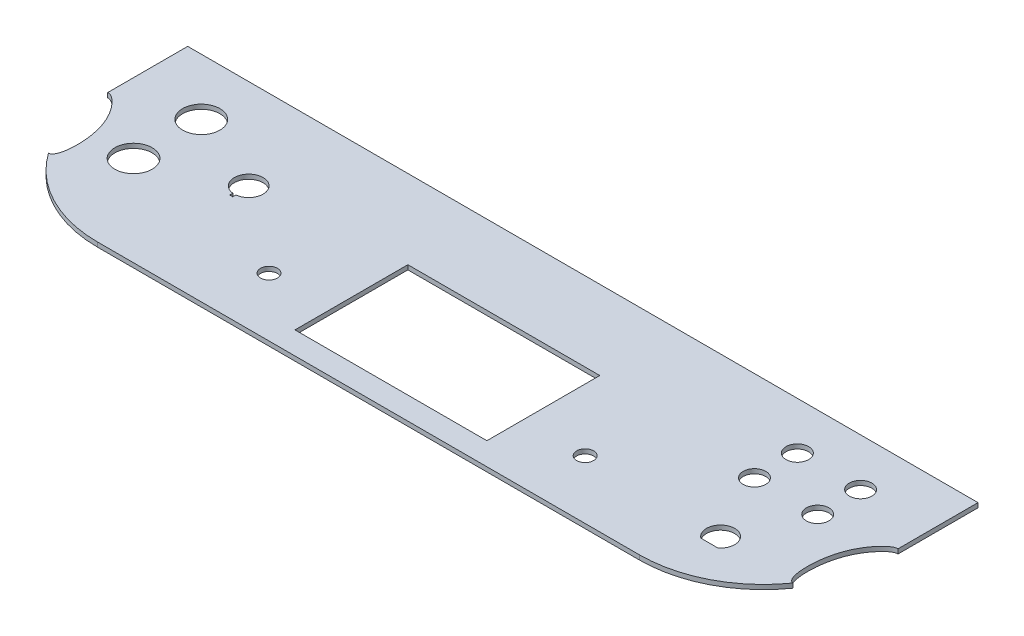
ISO-10303-21;
HEADER;
FILE_DESCRIPTION(('STEP AP214'),'2;1');
FILE_NAME('part.step','',(''),(''),'','','');
FILE_SCHEMA(('AUTOMOTIVE_DESIGN { 1 0 10303 214 1 1 1 1 }'));
ENDSEC;
DATA;
#1=APPLICATION_CONTEXT('core data for automotive mechanical design processes');
#2=APPLICATION_PROTOCOL_DEFINITION('international standard','automotive_design',2000,#1);
#3=PRODUCT_CONTEXT('',#1,'mechanical');
#4=PRODUCT('Part','Part','',(#3));
#5=PRODUCT_RELATED_PRODUCT_CATEGORY('part','',(#4));
#6=PRODUCT_DEFINITION_FORMATION('','',#4);
#7=PRODUCT_DEFINITION_CONTEXT('part definition',#1,'design');
#8=PRODUCT_DEFINITION('design','',#6,#7);
#9=PRODUCT_DEFINITION_SHAPE('','',#8);
#10=(LENGTH_UNIT() NAMED_UNIT(*) SI_UNIT(.MILLI.,.METRE.));
#11=(NAMED_UNIT(*) PLANE_ANGLE_UNIT() SI_UNIT($,.RADIAN.));
#12=(NAMED_UNIT(*) SI_UNIT($,.STERADIAN.) SOLID_ANGLE_UNIT());
#13=UNCERTAINTY_MEASURE_WITH_UNIT(LENGTH_MEASURE(1.E-05),#10,'distance_accuracy_value','');
#14=(GEOMETRIC_REPRESENTATION_CONTEXT(3) GLOBAL_UNCERTAINTY_ASSIGNED_CONTEXT((#13)) GLOBAL_UNIT_ASSIGNED_CONTEXT((#10,
#11,#12)) REPRESENTATION_CONTEXT('',''));
#15=CARTESIAN_POINT('',(0.,0.,0.));
#16=DIRECTION('',(0.,0.,1.));
#17=DIRECTION('',(1.,0.,0.));
#18=AXIS2_PLACEMENT_3D('',#15,#16,#17);
#19=CARTESIAN_POINT('',(152.4,2.54,14.612459998599));
#20=DIRECTION('',(0.,-1.,0.));
#21=DIRECTION('',(0.,0.,-1.));
#22=AXIS2_PLACEMENT_3D('',#19,#20,#21);
#23=CYLINDRICAL_SURFACE('',#22,69.8499999999999);
#24=DIRECTION('',(0.,1.,0.));
#25=VECTOR('',#24,1.);
#26=CARTESIAN_POINT('',(209.440289816918,1.27000000000001,54.929055063187));
#27=LINE('',#26,#25);
#28=CARTESIAN_POINT('',(209.440289816918,2.54,54.929055063187));
#29=VERTEX_POINT('',#28);
#30=CARTESIAN_POINT('',(209.440289816918,0.,54.929055063187));
#31=VERTEX_POINT('',#30);
#32=EDGE_CURVE('E384',#29,#31,#27,.F.);
#33=ORIENTED_EDGE('',*,*,#32,.F.);
#34=CARTESIAN_POINT('',(152.4,2.54,14.612459998599));
#35=DIRECTION('',(0.,1.,0.));
#36=DIRECTION('',(0.,0.,-1.));
#37=AXIS2_PLACEMENT_3D('',#34,#35,#36);
#38=CIRCLE('',#37,69.8499999999999);
#39=CARTESIAN_POINT('',(152.4,2.54,84.4624599985988));
#40=VERTEX_POINT('',#39);
#41=EDGE_CURVE('E414',#40,#29,#38,.T.);
#42=ORIENTED_EDGE('',*,*,#41,.F.);
#43=DIRECTION('',(0.,-1.,0.));
#44=VECTOR('',#43,1.);
#45=CARTESIAN_POINT('',(152.4,2.54,84.4624599985988));
#46=LINE('',#45,#44);
#47=CARTESIAN_POINT('',(152.4,0.,84.4624599985988));
#48=VERTEX_POINT('',#47);
#49=EDGE_CURVE('E415',#40,#48,#46,.T.);
#50=ORIENTED_EDGE('',*,*,#49,.T.);
#51=CARTESIAN_POINT('',(152.4,0.,14.612459998599));
#52=DIRECTION('',(0.,1.,0.));
#53=DIRECTION('',(0.,0.,-1.));
#54=AXIS2_PLACEMENT_3D('',#51,#52,#53);
#55=CIRCLE('',#54,69.8499999999999);
#56=EDGE_CURVE('E395',#48,#31,#55,.T.);
#57=ORIENTED_EDGE('',*,*,#56,.T.);
#58=EDGE_LOOP('',(#33,#42,#50,#57));
#59=FACE_BOUND('',#58,.T.);
#60=ADVANCED_FACE('F46',(#59),#23,.T.);
#61=CARTESIAN_POINT('',(222.25,2.54,14.612459998599));
#62=DIRECTION('',(-1.,0.,0.));
#63=DIRECTION('',(0.,0.,1.));
#64=AXIS2_PLACEMENT_3D('',#61,#62,#63);
#65=PLANE('',#64);
#66=DIRECTION('',(0.,1.,0.));
#67=VECTOR('',#66,1.);
#68=CARTESIAN_POINT('',(222.25,1.27000000000001,8.82955846627022));
#69=LINE('',#68,#67);
#70=CARTESIAN_POINT('',(222.250000005227,0.,8.82955846706889));
#71=VERTEX_POINT('',#70);
#72=CARTESIAN_POINT('',(222.250000005227,2.54,8.82955846706889));
#73=VERTEX_POINT('',#72);
#74=EDGE_CURVE('E307',#71,#73,#69,.T.);
#75=ORIENTED_EDGE('',*,*,#74,.F.);
#76=DIRECTION('',(0.,0.,-1.));
#77=VECTOR('',#76,1.);
#78=CARTESIAN_POINT('',(222.25,0.,14.612459998599));
#79=LINE('',#78,#77);
#80=CARTESIAN_POINT('',(222.25,0.,-36.187540001401));
#81=VERTEX_POINT('',#80);
#82=EDGE_CURVE('E380',#71,#81,#79,.T.);
#83=ORIENTED_EDGE('',*,*,#82,.T.);
#84=DIRECTION('',(0.,-1.,0.));
#85=VECTOR('',#84,1.);
#86=CARTESIAN_POINT('',(222.25,2.54,-36.187540001401));
#87=LINE('',#86,#85);
#88=CARTESIAN_POINT('',(222.25,2.54,-36.187540001401));
#89=VERTEX_POINT('',#88);
#90=EDGE_CURVE('E11',#89,#81,#87,.T.);
#91=ORIENTED_EDGE('',*,*,#90,.F.);
#92=DIRECTION('',(0.,0.,-1.));
#93=VECTOR('',#92,1.);
#94=CARTESIAN_POINT('',(222.25,2.54,14.612459998599));
#95=LINE('',#94,#93);
#96=EDGE_CURVE('E381',#73,#89,#95,.T.);
#97=ORIENTED_EDGE('',*,*,#96,.F.);
#98=EDGE_LOOP('',(#75,#83,#91,#97));
#99=FACE_BOUND('',#98,.T.);
#100=ADVANCED_FACE('F351',(#99),#65,.F.);
#101=CARTESIAN_POINT('',(152.4,2.54,14.612459998599));
#102=DIRECTION('',(0.,-1.,0.));
#103=DIRECTION('',(0.,0.,-1.));
#104=AXIS2_PLACEMENT_3D('',#101,#102,#103);
#105=PLANE('',#104);
#106=CARTESIAN_POINT('',(182.88,2.54,-9.51754000140104));
#107=DIRECTION('',(0.,1.,0.));
#108=DIRECTION('',(0.,0.,1.));
#109=AXIS2_PLACEMENT_3D('',#106,#107,#108);
#110=CIRCLE('',#109,6.35);
#111=CARTESIAN_POINT('',(182.88,2.54,-3.16754000140104));
#112=VERTEX_POINT('',#111);
#113=EDGE_CURVE('E237',#112,#112,#110,.T.);
#114=ORIENTED_EDGE('',*,*,#113,.F.);
#115=EDGE_LOOP('',(#114));
#116=FACE_BOUND('',#115,.T.);
#117=CARTESIAN_POINT('',(88.9,2.54,51.442459998599));
#118=DIRECTION('',(0.,1.,0.));
#119=DIRECTION('',(0.,0.,1.));
#120=AXIS2_PLACEMENT_3D('',#117,#118,#119);
#121=CIRCLE('',#120,4.7625);
#122=CARTESIAN_POINT('',(88.9,2.54,56.204959998599));
#123=VERTEX_POINT('',#122);
#124=EDGE_CURVE('E250',#123,#123,#121,.T.);
#125=ORIENTED_EDGE('',*,*,#124,.F.);
#126=EDGE_LOOP('',(#125));
#127=FACE_BOUND('',#126,.T.);
#128=CARTESIAN_POINT('',(147.32,2.54,-9.51754000140104));
#129=DIRECTION('',(0.,1.,0.));
#130=DIRECTION('',(0.,0.,1.));
#131=AXIS2_PLACEMENT_3D('',#128,#129,#130);
#132=CIRCLE('',#131,6.35);
#133=CARTESIAN_POINT('',(147.32,2.54,-3.16754000140104));
#134=VERTEX_POINT('',#133);
#135=EDGE_CURVE('E259',#134,#134,#132,.T.);
#136=ORIENTED_EDGE('',*,*,#135,.F.);
#137=EDGE_LOOP('',(#136));
#138=FACE_BOUND('',#137,.T.);
#139=CARTESIAN_POINT('',(147.32,2.54,14.612459998599));
#140=DIRECTION('',(0.,1.,0.));
#141=DIRECTION('',(0.,0.,1.));
#142=AXIS2_PLACEMENT_3D('',#139,#140,#141);
#143=CIRCLE('',#142,6.35);
#144=CARTESIAN_POINT('',(147.32,2.54,20.962459998599));
#145=VERTEX_POINT('',#144);
#146=EDGE_CURVE('E221',#145,#145,#143,.T.);
#147=ORIENTED_EDGE('',*,*,#146,.F.);
#148=EDGE_LOOP('',(#147));
#149=FACE_BOUND('',#148,.T.);
#150=DIRECTION('',(-1.,0.,0.));
#151=VECTOR('',#150,1.);
#152=CARTESIAN_POINT('',(171.1325,2.54,59.062459998599));
#153=LINE('',#152,#151);
#154=CARTESIAN_POINT('',(171.1325,2.54,59.062459998599));
#155=VERTEX_POINT('',#154);
#156=CARTESIAN_POINT('',(161.6075,2.54,59.062459998599));
#157=VERTEX_POINT('',#156);
#158=EDGE_CURVE('E238',#155,#157,#153,.T.);
#159=ORIENTED_EDGE('',*,*,#158,.T.);
#160=CARTESIAN_POINT('',(166.37,2.54,52.712459998599));
#161=DIRECTION('',(0.,1.,0.));
#162=DIRECTION('',(0.,0.,1.));
#163=AXIS2_PLACEMENT_3D('',#160,#161,#162);
#164=CIRCLE('',#163,7.9375);
#165=EDGE_CURVE('E61',#155,#157,#164,.T.);
#166=ORIENTED_EDGE('',*,*,#165,.F.);
#167=EDGE_LOOP('',(#159,#166));
#168=FACE_BOUND('',#167,.T.);
#169=CARTESIAN_POINT('',(-182.88,2.54,-4.43754000140104));
#170=DIRECTION('',(0.,1.,0.));
#171=DIRECTION('',(0.,0.,1.));
#172=AXIS2_PLACEMENT_3D('',#169,#170,#171);
#173=CIRCLE('',#172,10.5);
#174=CARTESIAN_POINT('',(-182.88,2.54,6.06245999859897));
#175=VERTEX_POINT('',#174);
#176=EDGE_CURVE('E202',#175,#175,#173,.T.);
#177=ORIENTED_EDGE('',*,*,#176,.F.);
#178=EDGE_LOOP('',(#177));
#179=FACE_BOUND('',#178,.T.);
#180=CARTESIAN_POINT('',(-137.16,2.54,14.612459998599));
#181=DIRECTION('',(0.,1.,0.));
#182=DIRECTION('',(0.,0.,1.));
#183=AXIS2_PLACEMENT_3D('',#180,#181,#182);
#184=CIRCLE('',#183,8.1);
#185=CARTESIAN_POINT('',(-136.31,2.54,22.6677377715873));
#186=VERTEX_POINT('',#185);
#187=CARTESIAN_POINT('',(-138.01,2.54,22.6677377715873));
#188=VERTEX_POINT('',#187);
#189=EDGE_CURVE('E195',#186,#188,#184,.T.);
#190=ORIENTED_EDGE('',*,*,#189,.F.);
#191=DIRECTION('',(0.,0.,-1.));
#192=VECTOR('',#191,1.);
#193=CARTESIAN_POINT('',(-136.31,2.54,24.412459998599));
#194=LINE('',#193,#192);
#195=CARTESIAN_POINT('',(-136.31,2.54,24.412459998599));
#196=VERTEX_POINT('',#195);
#197=EDGE_CURVE('E69',#196,#186,#194,.T.);
#198=ORIENTED_EDGE('',*,*,#197,.F.);
#199=DIRECTION('',(1.,0.,0.));
#200=VECTOR('',#199,1.);
#201=CARTESIAN_POINT('',(-138.01,2.54,24.412459998599));
#202=LINE('',#201,#200);
#203=CARTESIAN_POINT('',(-138.01,2.54,24.412459998599));
#204=VERTEX_POINT('',#203);
#205=EDGE_CURVE('E183',#204,#196,#202,.T.);
#206=ORIENTED_EDGE('',*,*,#205,.F.);
#207=DIRECTION('',(0.,0.,1.));
#208=VECTOR('',#207,1.);
#209=CARTESIAN_POINT('',(-138.01,2.54,22.6677377715873));
#210=LINE('',#209,#208);
#211=EDGE_CURVE('E189',#188,#204,#210,.T.);
#212=ORIENTED_EDGE('',*,*,#211,.F.);
#213=EDGE_LOOP('',(#190,#198,#206,#212));
#214=FACE_BOUND('',#213,.T.);
#215=CARTESIAN_POINT('',(-182.88,2.54,33.662459998599));
#216=DIRECTION('',(0.,1.,0.));
#217=DIRECTION('',(0.,0.,1.));
#218=AXIS2_PLACEMENT_3D('',#215,#216,#217);
#219=CIRCLE('',#218,10.5);
#220=CARTESIAN_POINT('',(-182.88,2.54,44.162459998599));
#221=VERTEX_POINT('',#220);
#222=EDGE_CURVE('E180',#221,#221,#219,.T.);
#223=ORIENTED_EDGE('',*,*,#222,.F.);
#224=EDGE_LOOP('',(#223));
#225=FACE_BOUND('',#224,.T.);
#226=CARTESIAN_POINT('',(-88.9,2.54,51.442459998599));
#227=DIRECTION('',(0.,1.,0.));
#228=DIRECTION('',(0.,0.,1.));
#229=AXIS2_PLACEMENT_3D('',#226,#227,#228);
#230=CIRCLE('',#229,4.7625);
#231=CARTESIAN_POINT('',(-88.9,2.54,56.204959998599));
#232=VERTEX_POINT('',#231);
#233=EDGE_CURVE('E795',#232,#232,#230,.T.);
#234=ORIENTED_EDGE('',*,*,#233,.F.);
#235=EDGE_LOOP('',(#234));
#236=FACE_BOUND('',#235,.T.);
#237=CARTESIAN_POINT('',(182.88,2.54,14.612459998599));
#238=DIRECTION('',(0.,1.,0.));
#239=DIRECTION('',(0.,0.,1.));
#240=AXIS2_PLACEMENT_3D('',#237,#238,#239);
#241=CIRCLE('',#240,6.35);
#242=CARTESIAN_POINT('',(182.88,2.54,20.962459998599));
#243=VERTEX_POINT('',#242);
#244=EDGE_CURVE('E278',#243,#243,#241,.T.);
#245=ORIENTED_EDGE('',*,*,#244,.F.);
#246=EDGE_LOOP('',(#245));
#247=FACE_BOUND('',#246,.T.);
#248=DIRECTION('',(1.,0.,0.));
#249=VECTOR('',#248,1.);
#250=CARTESIAN_POINT('',(53.975,2.54,71.7624599985988));
#251=LINE('',#250,#249);
#252=CARTESIAN_POINT('',(-53.975,2.54,71.7624599985988));
#253=VERTEX_POINT('',#252);
#254=CARTESIAN_POINT('',(53.975,2.54,71.7624599985988));
#255=VERTEX_POINT('',#254);
#256=EDGE_CURVE('E475',#253,#255,#251,.T.);
#257=ORIENTED_EDGE('',*,*,#256,.F.);
#258=DIRECTION('',(0.,0.,1.));
#259=VECTOR('',#258,1.);
#260=CARTESIAN_POINT('',(-53.975,2.54,71.7624599985988));
#261=LINE('',#260,#259);
#262=CARTESIAN_POINT('',(-53.975,2.54,8.26245999859884));
#263=VERTEX_POINT('',#262);
#264=EDGE_CURVE('E479',#263,#253,#261,.T.);
#265=ORIENTED_EDGE('',*,*,#264,.F.);
#266=DIRECTION('',(-1.,0.,0.));
#267=VECTOR('',#266,1.);
#268=CARTESIAN_POINT('',(53.975,2.54,8.26245999859883));
#269=LINE('',#268,#267);
#270=CARTESIAN_POINT('',(53.975,2.54,8.26245999859883));
#271=VERTEX_POINT('',#270);
#272=EDGE_CURVE('E466',#271,#263,#269,.T.);
#273=ORIENTED_EDGE('',*,*,#272,.F.);
#274=DIRECTION('',(0.,0.,-1.));
#275=VECTOR('',#274,1.);
#276=CARTESIAN_POINT('',(53.975,2.54,71.7624599985988));
#277=LINE('',#276,#275);
#278=EDGE_CURVE('E471',#255,#271,#277,.T.);
#279=ORIENTED_EDGE('',*,*,#278,.F.);
#280=EDGE_LOOP('',(#257,#265,#273,#279));
#281=FACE_BOUND('',#280,.T.);
#282=DIRECTION('',(0.,0.,1.));
#283=VECTOR('',#282,1.);
#284=CARTESIAN_POINT('',(-222.25,2.54,14.6124599985989));
#285=LINE('',#284,#283);
#286=CARTESIAN_POINT('',(-222.25,2.54,-36.1875400014011));
#287=VERTEX_POINT('',#286);
#288=CARTESIAN_POINT('',(-222.25,2.54,8.82955846706889));
#289=VERTEX_POINT('',#288);
#290=EDGE_CURVE('E428',#287,#289,#285,.T.);
#291=ORIENTED_EDGE('',*,*,#290,.T.);
#292=CARTESIAN_POINT('',(-209.440289816918,2.54,54.929055063187));
#293=CARTESIAN_POINT('',(-204.823931799075,2.54,55.5060786220691));
#294=CARTESIAN_POINT('',(-202.304901656525,2.54,25.2668165369349));
#295=CARTESIAN_POINT('',(-235.136564977557,2.54,-7.42848033513817));
#296=CARTESIAN_POINT('',(-216.288594077024,2.54,54.0730484707173));
#297=CARTESIAN_POINT('',(-209.440289816918,2.54,54.929055063187));
#298=B_SPLINE_CURVE_WITH_KNOTS('',3,(#292,#293,#294,#295,#296,#297),.UNSPECIFIED.,.T.,.F.,(4,1,
1,4),(0.,0.325803520485249,0.516674913714973,1.),.UNSPECIFIED.);
#299=CARTESIAN_POINT('',(-209.440289816918,2.54,54.929055063187));
#300=VERTEX_POINT('',#299);
#301=EDGE_CURVE('E282',#300,#289,#298,.T.);
#302=ORIENTED_EDGE('',*,*,#301,.F.);
#303=CARTESIAN_POINT('',(-152.4,2.54,14.612459998599));
#304=DIRECTION('',(0.,1.,0.));
#305=DIRECTION('',(0.,0.,-1.));
#306=AXIS2_PLACEMENT_3D('',#303,#304,#305);
#307=CIRCLE('',#306,69.8499999999999);
#308=CARTESIAN_POINT('',(-152.4,2.54,84.4624599985989));
#309=VERTEX_POINT('',#308);
#310=EDGE_CURVE('E436',#300,#309,#307,.T.);
#311=ORIENTED_EDGE('',*,*,#310,.T.);
#312=DIRECTION('',(1.,0.,0.));
#313=VECTOR('',#312,1.);
#314=CARTESIAN_POINT('',(152.4,2.54,84.4624599985988));
#315=LINE('',#314,#313);
#316=EDGE_CURVE('E420',#309,#40,#315,.T.);
#317=ORIENTED_EDGE('',*,*,#316,.T.);
#318=ORIENTED_EDGE('',*,*,#41,.T.);
#319=CARTESIAN_POINT('',(209.440289816918,2.54,54.929055063187));
#320=CARTESIAN_POINT('',(204.823931799075,2.54,55.5060786220691));
#321=CARTESIAN_POINT('',(202.304901656525,2.54,25.2668165369349));
#322=CARTESIAN_POINT('',(235.136564977557,2.54,-7.42848033513817));
#323=CARTESIAN_POINT('',(216.288594077024,2.54,54.0730484707173));
#324=CARTESIAN_POINT('',(209.440289816918,2.54,54.929055063187));
#325=B_SPLINE_CURVE_WITH_KNOTS('',3,(#319,#320,#321,#322,#323,#324),.UNSPECIFIED.,.T.,.F.,(4,1,
1,4),(0.,0.325803520485249,0.516674913714973,1.),.UNSPECIFIED.);
#326=EDGE_CURVE('E288',#29,#73,#325,.T.);
#327=ORIENTED_EDGE('',*,*,#326,.T.);
#328=ORIENTED_EDGE('',*,*,#96,.T.);
#329=DIRECTION('',(-1.,0.,0.));
#330=VECTOR('',#329,1.);
#331=CARTESIAN_POINT('',(222.25,2.54,-36.187540001401));
#332=LINE('',#331,#330);
#333=EDGE_CURVE('E443',#89,#287,#332,.T.);
#334=ORIENTED_EDGE('',*,*,#333,.T.);
#335=EDGE_LOOP('',(#291,#302,#311,#317,#318,#327,#328,#334));
#336=FACE_BOUND('',#335,.T.);
#337=ADVANCED_FACE('F192',(#116,#127,#138,#149,#168,#179,#214,#225,#236,#247,#281,#336),#105,.F.);
#338=CARTESIAN_POINT('',(152.4,0.,14.612459998599));
#339=DIRECTION('',(0.,-1.,0.));
#340=DIRECTION('',(0.,0.,-1.));
#341=AXIS2_PLACEMENT_3D('',#338,#339,#340);
#342=PLANE('',#341);
#343=CARTESIAN_POINT('',(182.88,0.,-9.51754000140104));
#344=DIRECTION('',(0.,1.,0.));
#345=DIRECTION('',(0.,0.,1.));
#346=AXIS2_PLACEMENT_3D('',#343,#344,#345);
#347=CIRCLE('',#346,6.35);
#348=CARTESIAN_POINT('',(182.88,0.,-3.16754000140104));
#349=VERTEX_POINT('',#348);
#350=EDGE_CURVE('E269',#349,#349,#347,.T.);
#351=ORIENTED_EDGE('',*,*,#350,.T.);
#352=EDGE_LOOP('',(#351));
#353=FACE_BOUND('',#352,.T.);
#354=CARTESIAN_POINT('',(88.9,0.,51.442459998599));
#355=DIRECTION('',(0.,1.,0.));
#356=DIRECTION('',(0.,0.,1.));
#357=AXIS2_PLACEMENT_3D('',#354,#355,#356);
#358=CIRCLE('',#357,4.7625);
#359=CARTESIAN_POINT('',(88.9,0.,56.204959998599));
#360=VERTEX_POINT('',#359);
#361=EDGE_CURVE('E255',#360,#360,#358,.T.);
#362=ORIENTED_EDGE('',*,*,#361,.T.);
#363=EDGE_LOOP('',(#362));
#364=FACE_BOUND('',#363,.T.);
#365=CARTESIAN_POINT('',(147.32,0.,-9.51754000140104));
#366=DIRECTION('',(0.,1.,0.));
#367=DIRECTION('',(0.,0.,1.));
#368=AXIS2_PLACEMENT_3D('',#365,#366,#367);
#369=CIRCLE('',#368,6.35);
#370=CARTESIAN_POINT('',(147.32,0.,-3.16754000140104));
#371=VERTEX_POINT('',#370);
#372=EDGE_CURVE('E225',#371,#371,#369,.T.);
#373=ORIENTED_EDGE('',*,*,#372,.T.);
#374=EDGE_LOOP('',(#373));
#375=FACE_BOUND('',#374,.T.);
#376=CARTESIAN_POINT('',(147.32,0.,14.612459998599));
#377=DIRECTION('',(0.,1.,0.));
#378=DIRECTION('',(0.,0.,1.));
#379=AXIS2_PLACEMENT_3D('',#376,#377,#378);
#380=CIRCLE('',#379,6.35);
#381=CARTESIAN_POINT('',(147.32,0.,20.962459998599));
#382=VERTEX_POINT('',#381);
#383=EDGE_CURVE('E226',#382,#382,#380,.T.);
#384=ORIENTED_EDGE('',*,*,#383,.T.);
#385=EDGE_LOOP('',(#384));
#386=FACE_BOUND('',#385,.T.);
#387=CARTESIAN_POINT('',(166.37,0.,52.712459998599));
#388=DIRECTION('',(0.,1.,0.));
#389=DIRECTION('',(0.,0.,1.));
#390=AXIS2_PLACEMENT_3D('',#387,#388,#389);
#391=CIRCLE('',#390,7.9375);
#392=CARTESIAN_POINT('',(171.1325,0.,59.062459998599));
#393=VERTEX_POINT('',#392);
#394=CARTESIAN_POINT('',(161.6075,0.,59.062459998599));
#395=VERTEX_POINT('',#394);
#396=EDGE_CURVE('E242',#393,#395,#391,.T.);
#397=ORIENTED_EDGE('',*,*,#396,.T.);
#398=DIRECTION('',(-1.,0.,0.));
#399=VECTOR('',#398,1.);
#400=CARTESIAN_POINT('',(171.1325,0.,59.062459998599));
#401=LINE('',#400,#399);
#402=EDGE_CURVE('E233',#393,#395,#401,.T.);
#403=ORIENTED_EDGE('',*,*,#402,.F.);
#404=EDGE_LOOP('',(#397,#403));
#405=FACE_BOUND('',#404,.T.);
#406=CARTESIAN_POINT('',(-182.88,0.,-4.43754000140104));
#407=DIRECTION('',(0.,1.,0.));
#408=DIRECTION('',(0.,0.,1.));
#409=AXIS2_PLACEMENT_3D('',#406,#407,#408);
#410=CIRCLE('',#409,10.5);
#411=CARTESIAN_POINT('',(-182.88,0.,6.06245999859897));
#412=VERTEX_POINT('',#411);
#413=EDGE_CURVE('E197',#412,#412,#410,.T.);
#414=ORIENTED_EDGE('',*,*,#413,.T.);
#415=EDGE_LOOP('',(#414));
#416=FACE_BOUND('',#415,.T.);
#417=DIRECTION('',(0.,0.,-1.));
#418=VECTOR('',#417,1.);
#419=CARTESIAN_POINT('',(-136.31,0.,24.412459998599));
#420=LINE('',#419,#418);
#421=CARTESIAN_POINT('',(-136.31,0.,24.412459998599));
#422=VERTEX_POINT('',#421);
#423=CARTESIAN_POINT('',(-136.31,0.,22.6677377715873));
#424=VERTEX_POINT('',#423);
#425=EDGE_CURVE('E174',#422,#424,#420,.T.);
#426=ORIENTED_EDGE('',*,*,#425,.T.);
#427=CARTESIAN_POINT('',(-137.16,0.,14.612459998599));
#428=DIRECTION('',(0.,1.,0.));
#429=DIRECTION('',(0.,0.,1.));
#430=AXIS2_PLACEMENT_3D('',#427,#428,#429);
#431=CIRCLE('',#430,8.1);
#432=CARTESIAN_POINT('',(-138.01,0.,22.6677377715873));
#433=VERTEX_POINT('',#432);
#434=EDGE_CURVE('E215',#424,#433,#431,.T.);
#435=ORIENTED_EDGE('',*,*,#434,.T.);
#436=DIRECTION('',(0.,0.,1.));
#437=VECTOR('',#436,1.);
#438=CARTESIAN_POINT('',(-138.01,0.,22.6677377715873));
#439=LINE('',#438,#437);
#440=CARTESIAN_POINT('',(-138.01,0.,24.412459998599));
#441=VERTEX_POINT('',#440);
#442=EDGE_CURVE('E210',#433,#441,#439,.T.);
#443=ORIENTED_EDGE('',*,*,#442,.T.);
#444=DIRECTION('',(1.,0.,0.));
#445=VECTOR('',#444,1.);
#446=CARTESIAN_POINT('',(-138.01,0.,24.412459998599));
#447=LINE('',#446,#445);
#448=EDGE_CURVE('E207',#441,#422,#447,.T.);
#449=ORIENTED_EDGE('',*,*,#448,.T.);
#450=EDGE_LOOP('',(#426,#435,#443,#449));
#451=FACE_BOUND('',#450,.T.);
#452=CARTESIAN_POINT('',(-182.88,0.,33.662459998599));
#453=DIRECTION('',(0.,1.,0.));
#454=DIRECTION('',(0.,0.,1.));
#455=AXIS2_PLACEMENT_3D('',#452,#453,#454);
#456=CIRCLE('',#455,10.5);
#457=CARTESIAN_POINT('',(-182.88,0.,44.162459998599));
#458=VERTEX_POINT('',#457);
#459=EDGE_CURVE('E539',#458,#458,#456,.T.);
#460=ORIENTED_EDGE('',*,*,#459,.T.);
#461=EDGE_LOOP('',(#460));
#462=FACE_BOUND('',#461,.T.);
#463=CARTESIAN_POINT('',(-88.9,0.,51.442459998599));
#464=DIRECTION('',(0.,1.,0.));
#465=DIRECTION('',(0.,0.,1.));
#466=AXIS2_PLACEMENT_3D('',#463,#464,#465);
#467=CIRCLE('',#466,4.7625);
#468=CARTESIAN_POINT('',(-88.9,0.,56.204959998599));
#469=VERTEX_POINT('',#468);
#470=EDGE_CURVE('E254',#469,#469,#467,.T.);
#471=ORIENTED_EDGE('',*,*,#470,.T.);
#472=EDGE_LOOP('',(#471));
#473=FACE_BOUND('',#472,.T.);
#474=CARTESIAN_POINT('',(182.88,0.,14.612459998599));
#475=DIRECTION('',(0.,1.,0.));
#476=DIRECTION('',(0.,0.,1.));
#477=AXIS2_PLACEMENT_3D('',#474,#475,#476);
#478=CIRCLE('',#477,6.35);
#479=CARTESIAN_POINT('',(182.88,0.,20.962459998599));
#480=VERTEX_POINT('',#479);
#481=EDGE_CURVE('E273',#480,#480,#478,.T.);
#482=ORIENTED_EDGE('',*,*,#481,.T.);
#483=EDGE_LOOP('',(#482));
#484=FACE_BOUND('',#483,.T.);
#485=CARTESIAN_POINT('',(-209.440289816918,0.,54.929055063187));
#486=CARTESIAN_POINT('',(-204.823931799075,0.,55.5060786220691));
#487=CARTESIAN_POINT('',(-202.304901656525,0.,25.2668165369349));
#488=CARTESIAN_POINT('',(-235.136564977557,0.,-7.42848033513817));
#489=CARTESIAN_POINT('',(-216.288594077024,0.,54.0730484707173));
#490=CARTESIAN_POINT('',(-209.440289816918,0.,54.929055063187));
#491=B_SPLINE_CURVE_WITH_KNOTS('',3,(#485,#486,#487,#488,#489,#490),.UNSPECIFIED.,.T.,.F.,(4,1,
1,4),(0.,0.325803520485249,0.516674913714973,1.),.UNSPECIFIED.);
#492=CARTESIAN_POINT('',(-209.440289816918,0.,54.929055063187));
#493=VERTEX_POINT('',#492);
#494=CARTESIAN_POINT('',(-222.25,0.,8.82955846706889));
#495=VERTEX_POINT('',#494);
#496=EDGE_CURVE('E287',#493,#495,#491,.T.);
#497=ORIENTED_EDGE('',*,*,#496,.T.);
#498=DIRECTION('',(0.,0.,1.));
#499=VECTOR('',#498,1.);
#500=CARTESIAN_POINT('',(-222.25,0.,14.6124599985989));
#501=LINE('',#500,#499);
#502=CARTESIAN_POINT('',(-222.25,0.,-36.1875400014011));
#503=VERTEX_POINT('',#502);
#504=EDGE_CURVE('E399',#503,#495,#501,.T.);
#505=ORIENTED_EDGE('',*,*,#504,.F.);
#506=DIRECTION('',(-1.,0.,0.));
#507=VECTOR('',#506,1.);
#508=CARTESIAN_POINT('',(222.25,0.,-36.187540001401));
#509=LINE('',#508,#507);
#510=EDGE_CURVE('E393',#81,#503,#509,.T.);
#511=ORIENTED_EDGE('',*,*,#510,.F.);
#512=ORIENTED_EDGE('',*,*,#82,.F.);
#513=CARTESIAN_POINT('',(209.440289816918,0.,54.929055063187));
#514=CARTESIAN_POINT('',(204.823931799075,0.,55.5060786220691));
#515=CARTESIAN_POINT('',(202.304901656525,0.,25.2668165369349));
#516=CARTESIAN_POINT('',(235.136564977557,0.,-7.42848033513817));
#517=CARTESIAN_POINT('',(216.288594077024,0.,54.0730484707173));
#518=CARTESIAN_POINT('',(209.440289816918,0.,54.929055063187));
#519=B_SPLINE_CURVE_WITH_KNOTS('',3,(#513,#514,#515,#516,#517,#518),.UNSPECIFIED.,.T.,.F.,(4,1,
1,4),(0.,0.325803520485249,0.516674913714973,1.),.UNSPECIFIED.);
#520=EDGE_CURVE('E277',#31,#71,#519,.T.);
#521=ORIENTED_EDGE('',*,*,#520,.F.);
#522=ORIENTED_EDGE('',*,*,#56,.F.);
#523=DIRECTION('',(1.,0.,0.));
#524=VECTOR('',#523,1.);
#525=CARTESIAN_POINT('',(152.4,0.,84.4624599985988));
#526=LINE('',#525,#524);
#527=CARTESIAN_POINT('',(-152.4,0.,84.4624599985989));
#528=VERTEX_POINT('',#527);
#529=EDGE_CURVE('E411',#528,#48,#526,.T.);
#530=ORIENTED_EDGE('',*,*,#529,.F.);
#531=CARTESIAN_POINT('',(-152.4,0.,14.612459998599));
#532=DIRECTION('',(0.,1.,0.));
#533=DIRECTION('',(0.,0.,-1.));
#534=AXIS2_PLACEMENT_3D('',#531,#532,#533);
#535=CIRCLE('',#534,69.8499999999999);
#536=EDGE_CURVE('E408',#493,#528,#535,.T.);
#537=ORIENTED_EDGE('',*,*,#536,.F.);
#538=EDGE_LOOP('',(#497,#505,#511,#512,#521,#522,#530,#537));
#539=FACE_BOUND('',#538,.T.);
#540=DIRECTION('',(0.,0.,1.));
#541=VECTOR('',#540,1.);
#542=CARTESIAN_POINT('',(-53.975,0.,71.7624599985988));
#543=LINE('',#542,#541);
#544=CARTESIAN_POINT('',(-53.975,0.,8.26245999859884));
#545=VERTEX_POINT('',#544);
#546=CARTESIAN_POINT('',(-53.975,0.,71.7624599985988));
#547=VERTEX_POINT('',#546);
#548=EDGE_CURVE('E470',#545,#547,#543,.T.);
#549=ORIENTED_EDGE('',*,*,#548,.T.);
#550=DIRECTION('',(1.,0.,0.));
#551=VECTOR('',#550,1.);
#552=CARTESIAN_POINT('',(53.975,0.,71.7624599985988));
#553=LINE('',#552,#551);
#554=CARTESIAN_POINT('',(53.975,0.,71.7624599985988));
#555=VERTEX_POINT('',#554);
#556=EDGE_CURVE('E489',#547,#555,#553,.T.);
#557=ORIENTED_EDGE('',*,*,#556,.T.);
#558=DIRECTION('',(0.,0.,-1.));
#559=VECTOR('',#558,1.);
#560=CARTESIAN_POINT('',(53.975,0.,71.7624599985988));
#561=LINE('',#560,#559);
#562=CARTESIAN_POINT('',(53.975,0.,8.26245999859883));
#563=VERTEX_POINT('',#562);
#564=EDGE_CURVE('E485',#555,#563,#561,.T.);
#565=ORIENTED_EDGE('',*,*,#564,.T.);
#566=DIRECTION('',(-1.,0.,0.));
#567=VECTOR('',#566,1.);
#568=CARTESIAN_POINT('',(53.975,0.,8.26245999859883));
#569=LINE('',#568,#567);
#570=EDGE_CURVE('E458',#563,#545,#569,.T.);
#571=ORIENTED_EDGE('',*,*,#570,.T.);
#572=EDGE_LOOP('',(#549,#557,#565,#571));
#573=FACE_BOUND('',#572,.T.);
#574=ADVANCED_FACE('F350',(#353,#364,#375,#386,#405,#416,#451,#462,#473,#484,#539,#573),#342,.T.);
#575=CARTESIAN_POINT('',(222.25,2.54,-36.187540001401));
#576=DIRECTION('',(0.,0.,1.));
#577=DIRECTION('',(1.,0.,0.));
#578=AXIS2_PLACEMENT_3D('',#575,#576,#577);
#579=PLANE('',#578);
#580=ORIENTED_EDGE('',*,*,#510,.T.);
#581=DIRECTION('',(0.,-1.,0.));
#582=VECTOR('',#581,1.);
#583=CARTESIAN_POINT('',(-222.25,2.54,-36.1875400014011));
#584=LINE('',#583,#582);
#585=EDGE_CURVE('E54',#287,#503,#584,.T.);
#586=ORIENTED_EDGE('',*,*,#585,.F.);
#587=ORIENTED_EDGE('',*,*,#333,.F.);
#588=ORIENTED_EDGE('',*,*,#90,.T.);
#589=EDGE_LOOP('',(#580,#586,#587,#588));
#590=FACE_BOUND('',#589,.T.);
#591=ADVANCED_FACE('F355',(#590),#579,.F.);
#592=CARTESIAN_POINT('',(-222.25,2.54,14.6124599985989));
#593=DIRECTION('',(1.,0.,0.));
#594=DIRECTION('',(0.,0.,-1.));
#595=AXIS2_PLACEMENT_3D('',#592,#593,#594);
#596=PLANE('',#595);
#597=ORIENTED_EDGE('',*,*,#504,.T.);
#598=DIRECTION('',(0.,1.,0.));
#599=VECTOR('',#598,1.);
#600=CARTESIAN_POINT('',(-222.25,-51.0674489468276,8.82955846706889));
#601=LINE('',#600,#599);
#602=EDGE_CURVE('E297',#495,#289,#601,.T.);
#603=ORIENTED_EDGE('',*,*,#602,.T.);
#604=ORIENTED_EDGE('',*,*,#290,.F.);
#605=ORIENTED_EDGE('',*,*,#585,.T.);
#606=EDGE_LOOP('',(#597,#603,#604,#605));
#607=FACE_BOUND('',#606,.T.);
#608=ADVANCED_FACE('F363',(#607),#596,.F.);
#609=CARTESIAN_POINT('',(-152.4,2.54,14.612459998599));
#610=DIRECTION('',(0.,-1.,0.));
#611=DIRECTION('',(0.,0.,-1.));
#612=AXIS2_PLACEMENT_3D('',#609,#610,#611);
#613=CYLINDRICAL_SURFACE('',#612,69.8499999999999);
#614=ORIENTED_EDGE('',*,*,#310,.F.);
#615=DIRECTION('',(0.,1.,0.));
#616=VECTOR('',#615,1.);
#617=CARTESIAN_POINT('',(-209.440289816918,-51.0674489468276,54.929055063187));
#618=LINE('',#617,#616);
#619=EDGE_CURVE('E304',#493,#300,#618,.T.);
#620=ORIENTED_EDGE('',*,*,#619,.F.);
#621=ORIENTED_EDGE('',*,*,#536,.T.);
#622=DIRECTION('',(0.,-1.,0.));
#623=VECTOR('',#622,1.);
#624=CARTESIAN_POINT('',(-152.4,2.54,84.4624599985989));
#625=LINE('',#624,#623);
#626=EDGE_CURVE('E419',#309,#528,#625,.T.);
#627=ORIENTED_EDGE('',*,*,#626,.F.);
#628=EDGE_LOOP('',(#614,#620,#621,#627));
#629=FACE_BOUND('',#628,.T.);
#630=ADVANCED_FACE('F359',(#629),#613,.T.);
#631=CARTESIAN_POINT('',(152.4,2.54,84.4624599985988));
#632=DIRECTION('',(0.,0.,-1.));
#633=DIRECTION('',(-1.,0.,0.));
#634=AXIS2_PLACEMENT_3D('',#631,#632,#633);
#635=PLANE('',#634);
#636=ORIENTED_EDGE('',*,*,#529,.T.);
#637=ORIENTED_EDGE('',*,*,#49,.F.);
#638=ORIENTED_EDGE('',*,*,#316,.F.);
#639=ORIENTED_EDGE('',*,*,#626,.T.);
#640=EDGE_LOOP('',(#636,#637,#638,#639));
#641=FACE_BOUND('',#640,.T.);
#642=ADVANCED_FACE('F346',(#641),#635,.F.);
#643=CARTESIAN_POINT('',(-53.975,0.,71.7624599985988));
#644=DIRECTION('',(-1.,0.,0.));
#645=DIRECTION('',(0.,0.,1.));
#646=AXIS2_PLACEMENT_3D('',#643,#644,#645);
#647=PLANE('',#646);
#648=ORIENTED_EDGE('',*,*,#264,.T.);
#649=DIRECTION('',(0.,1.,0.));
#650=VECTOR('',#649,1.);
#651=CARTESIAN_POINT('',(-53.975,0.,71.7624599985988));
#652=LINE('',#651,#650);
#653=EDGE_CURVE('E453',#547,#253,#652,.T.);
#654=ORIENTED_EDGE('',*,*,#653,.F.);
#655=ORIENTED_EDGE('',*,*,#548,.F.);
#656=DIRECTION('',(0.,1.,0.));
#657=VECTOR('',#656,1.);
#658=CARTESIAN_POINT('',(-53.975,0.,8.26245999859884));
#659=LINE('',#658,#657);
#660=EDGE_CURVE('E401',#545,#263,#659,.T.);
#661=ORIENTED_EDGE('',*,*,#660,.T.);
#662=EDGE_LOOP('',(#648,#654,#655,#661));
#663=FACE_BOUND('',#662,.T.);
#664=ADVANCED_FACE('F336',(#663),#647,.F.);
#665=CARTESIAN_POINT('',(53.975,0.,8.26245999859883));
#666=DIRECTION('',(0.,0.,-1.));
#667=DIRECTION('',(-1.,0.,0.));
#668=AXIS2_PLACEMENT_3D('',#665,#666,#667);
#669=PLANE('',#668);
#670=ORIENTED_EDGE('',*,*,#272,.T.);
#671=ORIENTED_EDGE('',*,*,#660,.F.);
#672=ORIENTED_EDGE('',*,*,#570,.F.);
#673=DIRECTION('',(0.,1.,0.));
#674=VECTOR('',#673,1.);
#675=CARTESIAN_POINT('',(53.975,0.,8.26245999859883));
#676=LINE('',#675,#674);
#677=EDGE_CURVE('E461',#563,#271,#676,.T.);
#678=ORIENTED_EDGE('',*,*,#677,.T.);
#679=EDGE_LOOP('',(#670,#671,#672,#678));
#680=FACE_BOUND('',#679,.T.);
#681=ADVANCED_FACE('F332',(#680),#669,.F.);
#682=CARTESIAN_POINT('',(53.975,0.,71.7624599985988));
#683=DIRECTION('',(1.,0.,0.));
#684=DIRECTION('',(0.,0.,-1.));
#685=AXIS2_PLACEMENT_3D('',#682,#683,#684);
#686=PLANE('',#685);
#687=ORIENTED_EDGE('',*,*,#278,.T.);
#688=ORIENTED_EDGE('',*,*,#677,.F.);
#689=ORIENTED_EDGE('',*,*,#564,.F.);
#690=DIRECTION('',(0.,1.,0.));
#691=VECTOR('',#690,1.);
#692=CARTESIAN_POINT('',(53.975,0.,71.7624599985988));
#693=LINE('',#692,#691);
#694=EDGE_CURVE('E457',#555,#255,#693,.T.);
#695=ORIENTED_EDGE('',*,*,#694,.T.);
#696=EDGE_LOOP('',(#687,#688,#689,#695));
#697=FACE_BOUND('',#696,.T.);
#698=ADVANCED_FACE('F335',(#697),#686,.F.);
#699=CARTESIAN_POINT('',(53.975,0.,71.7624599985988));
#700=DIRECTION('',(0.,0.,1.));
#701=DIRECTION('',(1.,0.,0.));
#702=AXIS2_PLACEMENT_3D('',#699,#700,#701);
#703=PLANE('',#702);
#704=ORIENTED_EDGE('',*,*,#256,.T.);
#705=ORIENTED_EDGE('',*,*,#694,.F.);
#706=ORIENTED_EDGE('',*,*,#556,.F.);
#707=ORIENTED_EDGE('',*,*,#653,.T.);
#708=EDGE_LOOP('',(#704,#705,#706,#707));
#709=FACE_BOUND('',#708,.T.);
#710=ADVANCED_FACE('F330',(#709),#703,.F.);
#711=CARTESIAN_POINT('',(209.440289816918,-51.0674489468276,54.929055063187));
#712=CARTESIAN_POINT('',(204.823931799075,-51.0674489468276,55.5060786220691));
#713=CARTESIAN_POINT('',(202.304901656525,-51.0674489468276,25.2668165369349));
#714=CARTESIAN_POINT('',(235.136564977557,-51.0674489468276,-7.42848033513817));
#715=CARTESIAN_POINT('',(216.288594077024,-51.0674489468276,54.0730484707173));
#716=CARTESIAN_POINT('',(209.440289816918,-51.0674489468276,54.929055063187));
#717=B_SPLINE_CURVE_WITH_KNOTS('',3,(#711,#712,#713,#714,#715,#716),.UNSPECIFIED.,.T.,.F.,(4,1,
1,4),(0.,0.325803520485249,0.516674913714973,1.),.UNSPECIFIED.);
#718=DIRECTION('',(0.,1.,0.));
#719=VECTOR('',#718,1.);
#720=SURFACE_OF_LINEAR_EXTRUSION('',#717,#719);
#721=ORIENTED_EDGE('',*,*,#32,.T.);
#722=ORIENTED_EDGE('',*,*,#520,.T.);
#723=ORIENTED_EDGE('',*,*,#74,.T.);
#724=ORIENTED_EDGE('',*,*,#326,.F.);
#725=EDGE_LOOP('',(#721,#722,#723,#724));
#726=FACE_BOUND('',#725,.T.);
#727=ADVANCED_FACE('F325',(#726),#720,.T.);
#728=CARTESIAN_POINT('',(-209.440289816918,-51.0674489468276,54.929055063187));
#729=CARTESIAN_POINT('',(-204.823931799075,-51.0674489468276,55.5060786220691));
#730=CARTESIAN_POINT('',(-202.304901656525,-51.0674489468276,25.2668165369349));
#731=CARTESIAN_POINT('',(-235.136564977557,-51.0674489468276,-7.42848033513817));
#732=CARTESIAN_POINT('',(-216.288594077024,-51.0674489468276,54.0730484707173));
#733=CARTESIAN_POINT('',(-209.440289816918,-51.0674489468276,54.929055063187));
#734=B_SPLINE_CURVE_WITH_KNOTS('',3,(#728,#729,#730,#731,#732,#733),.UNSPECIFIED.,.T.,.F.,(4,1,
1,4),(0.,0.325803520485249,0.516674913714973,1.),.UNSPECIFIED.);
#735=DIRECTION('',(0.,1.,0.));
#736=VECTOR('',#735,1.);
#737=SURFACE_OF_LINEAR_EXTRUSION('',#734,#736);
#738=ORIENTED_EDGE('',*,*,#619,.T.);
#739=ORIENTED_EDGE('',*,*,#301,.T.);
#740=ORIENTED_EDGE('',*,*,#602,.F.);
#741=ORIENTED_EDGE('',*,*,#496,.F.);
#742=EDGE_LOOP('',(#738,#739,#740,#741));
#743=FACE_BOUND('',#742,.T.);
#744=ADVANCED_FACE('F320',(#743),#737,.F.);
#745=CARTESIAN_POINT('',(182.88,0.,14.612459998599));
#746=DIRECTION('',(0.,1.,0.));
#747=DIRECTION('',(0.,0.,1.));
#748=AXIS2_PLACEMENT_3D('',#745,#746,#747);
#749=CYLINDRICAL_SURFACE('',#748,6.35);
#750=ORIENTED_EDGE('',*,*,#481,.F.);
#751=EDGE_LOOP('',(#750));
#752=FACE_BOUND('',#751,.T.);
#753=ORIENTED_EDGE('',*,*,#244,.T.);
#754=EDGE_LOOP('',(#753));
#755=FACE_BOUND('',#754,.T.);
#756=ADVANCED_FACE('F324',(#752,#755),#749,.F.);
#757=CARTESIAN_POINT('',(-88.9,0.,51.442459998599));
#758=DIRECTION('',(0.,1.,0.));
#759=DIRECTION('',(0.,0.,1.));
#760=AXIS2_PLACEMENT_3D('',#757,#758,#759);
#761=CYLINDRICAL_SURFACE('',#760,4.7625);
#762=ORIENTED_EDGE('',*,*,#470,.F.);
#763=EDGE_LOOP('',(#762));
#764=FACE_BOUND('',#763,.T.);
#765=ORIENTED_EDGE('',*,*,#233,.T.);
#766=EDGE_LOOP('',(#765));
#767=FACE_BOUND('',#766,.T.);
#768=ADVANCED_FACE('F547',(#764,#767),#761,.F.);
#769=CARTESIAN_POINT('',(-182.88,0.,33.662459998599));
#770=DIRECTION('',(0.,1.,0.));
#771=DIRECTION('',(0.,0.,1.));
#772=AXIS2_PLACEMENT_3D('',#769,#770,#771);
#773=CYLINDRICAL_SURFACE('',#772,10.5);
#774=ORIENTED_EDGE('',*,*,#459,.F.);
#775=EDGE_LOOP('',(#774));
#776=FACE_BOUND('',#775,.T.);
#777=ORIENTED_EDGE('',*,*,#222,.T.);
#778=EDGE_LOOP('',(#777));
#779=FACE_BOUND('',#778,.T.);
#780=ADVANCED_FACE('F562',(#776,#779),#773,.F.);
#781=CARTESIAN_POINT('',(-136.31,0.,24.412459998599));
#782=DIRECTION('',(1.,0.,0.));
#783=DIRECTION('',(0.,0.,-1.));
#784=AXIS2_PLACEMENT_3D('',#781,#782,#783);
#785=PLANE('',#784);
#786=ORIENTED_EDGE('',*,*,#197,.T.);
#787=DIRECTION('',(0.,1.,0.));
#788=VECTOR('',#787,1.);
#789=CARTESIAN_POINT('',(-136.31,0.,22.6677377715873));
#790=LINE('',#789,#788);
#791=EDGE_CURVE('E211',#424,#186,#790,.T.);
#792=ORIENTED_EDGE('',*,*,#791,.F.);
#793=ORIENTED_EDGE('',*,*,#425,.F.);
#794=DIRECTION('',(0.,1.,0.));
#795=VECTOR('',#794,1.);
#796=CARTESIAN_POINT('',(-136.31,0.,24.412459998599));
#797=LINE('',#796,#795);
#798=EDGE_CURVE('E170',#422,#196,#797,.T.);
#799=ORIENTED_EDGE('',*,*,#798,.T.);
#800=EDGE_LOOP('',(#786,#792,#793,#799));
#801=FACE_BOUND('',#800,.T.);
#802=ADVANCED_FACE('F172',(#801),#785,.F.);
#803=CARTESIAN_POINT('',(-138.01,0.,24.412459998599));
#804=DIRECTION('',(0.,0.,1.));
#805=DIRECTION('',(1.,0.,0.));
#806=AXIS2_PLACEMENT_3D('',#803,#804,#805);
#807=PLANE('',#806);
#808=ORIENTED_EDGE('',*,*,#205,.T.);
#809=ORIENTED_EDGE('',*,*,#798,.F.);
#810=ORIENTED_EDGE('',*,*,#448,.F.);
#811=DIRECTION('',(0.,1.,0.));
#812=VECTOR('',#811,1.);
#813=CARTESIAN_POINT('',(-138.01,0.,24.412459998599));
#814=LINE('',#813,#812);
#815=EDGE_CURVE('E179',#441,#204,#814,.T.);
#816=ORIENTED_EDGE('',*,*,#815,.T.);
#817=EDGE_LOOP('',(#808,#809,#810,#816));
#818=FACE_BOUND('',#817,.T.);
#819=ADVANCED_FACE('F184',(#818),#807,.F.);
#820=CARTESIAN_POINT('',(-138.01,0.,22.6677377715873));
#821=DIRECTION('',(-1.,0.,0.));
#822=DIRECTION('',(0.,0.,1.));
#823=AXIS2_PLACEMENT_3D('',#820,#821,#822);
#824=PLANE('',#823);
#825=ORIENTED_EDGE('',*,*,#211,.T.);
#826=ORIENTED_EDGE('',*,*,#815,.F.);
#827=ORIENTED_EDGE('',*,*,#442,.F.);
#828=DIRECTION('',(0.,1.,0.));
#829=VECTOR('',#828,1.);
#830=CARTESIAN_POINT('',(-138.01,0.,22.6677377715873));
#831=LINE('',#830,#829);
#832=EDGE_CURVE('E523',#433,#188,#831,.T.);
#833=ORIENTED_EDGE('',*,*,#832,.T.);
#834=EDGE_LOOP('',(#825,#826,#827,#833));
#835=FACE_BOUND('',#834,.T.);
#836=ADVANCED_FACE('F529',(#835),#824,.F.);
#837=CARTESIAN_POINT('',(-137.16,0.,14.612459998599));
#838=DIRECTION('',(0.,1.,0.));
#839=DIRECTION('',(0.,0.,1.));
#840=AXIS2_PLACEMENT_3D('',#837,#838,#839);
#841=CYLINDRICAL_SURFACE('',#840,8.1);
#842=ORIENTED_EDGE('',*,*,#189,.T.);
#843=ORIENTED_EDGE('',*,*,#832,.F.);
#844=ORIENTED_EDGE('',*,*,#434,.F.);
#845=ORIENTED_EDGE('',*,*,#791,.T.);
#846=EDGE_LOOP('',(#842,#843,#844,#845));
#847=FACE_BOUND('',#846,.T.);
#848=ADVANCED_FACE('F533',(#847),#841,.F.);
#849=CARTESIAN_POINT('',(-182.88,0.,-4.43754000140104));
#850=DIRECTION('',(0.,1.,0.));
#851=DIRECTION('',(0.,0.,1.));
#852=AXIS2_PLACEMENT_3D('',#849,#850,#851);
#853=CYLINDRICAL_SURFACE('',#852,10.5);
#854=ORIENTED_EDGE('',*,*,#413,.F.);
#855=EDGE_LOOP('',(#854));
#856=FACE_BOUND('',#855,.T.);
#857=ORIENTED_EDGE('',*,*,#176,.T.);
#858=EDGE_LOOP('',(#857));
#859=FACE_BOUND('',#858,.T.);
#860=ADVANCED_FACE('F572',(#856,#859),#853,.F.);
#861=CARTESIAN_POINT('',(166.37,0.,52.712459998599));
#862=DIRECTION('',(0.,1.,0.));
#863=DIRECTION('',(0.,0.,1.));
#864=AXIS2_PLACEMENT_3D('',#861,#862,#863);
#865=CYLINDRICAL_SURFACE('',#864,7.9375);
#866=ORIENTED_EDGE('',*,*,#165,.T.);
#867=DIRECTION('',(0.,1.,0.));
#868=VECTOR('',#867,1.);
#869=CARTESIAN_POINT('',(161.6075,0.,59.062459998599));
#870=LINE('',#869,#868);
#871=EDGE_CURVE('E230',#395,#157,#870,.T.);
#872=ORIENTED_EDGE('',*,*,#871,.F.);
#873=ORIENTED_EDGE('',*,*,#396,.F.);
#874=DIRECTION('',(0.,1.,0.));
#875=VECTOR('',#874,1.);
#876=CARTESIAN_POINT('',(171.1325,0.,59.062459998599));
#877=LINE('',#876,#875);
#878=EDGE_CURVE('E234',#393,#155,#877,.T.);
#879=ORIENTED_EDGE('',*,*,#878,.T.);
#880=EDGE_LOOP('',(#866,#872,#873,#879));
#881=FACE_BOUND('',#880,.T.);
#882=ADVANCED_FACE('F575',(#881),#865,.F.);
#883=CARTESIAN_POINT('',(171.1325,0.,59.062459998599));
#884=DIRECTION('',(0.,0.,-1.));
#885=DIRECTION('',(-1.,0.,0.));
#886=AXIS2_PLACEMENT_3D('',#883,#884,#885);
#887=PLANE('',#886);
#888=ORIENTED_EDGE('',*,*,#158,.F.);
#889=ORIENTED_EDGE('',*,*,#878,.F.);
#890=ORIENTED_EDGE('',*,*,#402,.T.);
#891=ORIENTED_EDGE('',*,*,#871,.T.);
#892=EDGE_LOOP('',(#888,#889,#890,#891));
#893=FACE_BOUND('',#892,.T.);
#894=ADVANCED_FACE('F589',(#893),#887,.T.);
#895=CARTESIAN_POINT('',(147.32,0.,14.612459998599));
#896=DIRECTION('',(0.,1.,0.));
#897=DIRECTION('',(0.,0.,1.));
#898=AXIS2_PLACEMENT_3D('',#895,#896,#897);
#899=CYLINDRICAL_SURFACE('',#898,6.35);
#900=ORIENTED_EDGE('',*,*,#383,.F.);
#901=EDGE_LOOP('',(#900));
#902=FACE_BOUND('',#901,.T.);
#903=ORIENTED_EDGE('',*,*,#146,.T.);
#904=EDGE_LOOP('',(#903));
#905=FACE_BOUND('',#904,.T.);
#906=ADVANCED_FACE('F585',(#902,#905),#899,.F.);
#907=CARTESIAN_POINT('',(147.32,0.,-9.51754000140104));
#908=DIRECTION('',(0.,1.,0.));
#909=DIRECTION('',(0.,0.,1.));
#910=AXIS2_PLACEMENT_3D('',#907,#908,#909);
#911=CYLINDRICAL_SURFACE('',#910,6.35);
#912=ORIENTED_EDGE('',*,*,#372,.F.);
#913=EDGE_LOOP('',(#912));
#914=FACE_BOUND('',#913,.T.);
#915=ORIENTED_EDGE('',*,*,#135,.T.);
#916=EDGE_LOOP('',(#915));
#917=FACE_BOUND('',#916,.T.);
#918=ADVANCED_FACE('F588',(#914,#917),#911,.F.);
#919=CARTESIAN_POINT('',(88.9,0.,51.442459998599));
#920=DIRECTION('',(0.,1.,0.));
#921=DIRECTION('',(0.,0.,1.));
#922=AXIS2_PLACEMENT_3D('',#919,#920,#921);
#923=CYLINDRICAL_SURFACE('',#922,4.7625);
#924=ORIENTED_EDGE('',*,*,#361,.F.);
#925=EDGE_LOOP('',(#924));
#926=FACE_BOUND('',#925,.T.);
#927=ORIENTED_EDGE('',*,*,#124,.T.);
#928=EDGE_LOOP('',(#927));
#929=FACE_BOUND('',#928,.T.);
#930=ADVANCED_FACE('F596',(#926,#929),#923,.F.);
#931=CARTESIAN_POINT('',(182.88,0.,-9.51754000140104));
#932=DIRECTION('',(0.,1.,0.));
#933=DIRECTION('',(0.,0.,1.));
#934=AXIS2_PLACEMENT_3D('',#931,#932,#933);
#935=CYLINDRICAL_SURFACE('',#934,6.35);
#936=ORIENTED_EDGE('',*,*,#350,.F.);
#937=EDGE_LOOP('',(#936));
#938=FACE_BOUND('',#937,.T.);
#939=ORIENTED_EDGE('',*,*,#113,.T.);
#940=EDGE_LOOP('',(#939));
#941=FACE_BOUND('',#940,.T.);
#942=ADVANCED_FACE('F599',(#938,#941),#935,.F.);
#943=CLOSED_SHELL('',(#60,#100,#337,#574,#591,#608,#630,#642,#664,#681,#698,#710,#727,#744,#756,
#768,#780,#802,#819,#836,#848,#860,#882,#894,#906,#918,#930,#942));
#944=MANIFOLD_SOLID_BREP('B2',#943);
#945=ADVANCED_BREP_SHAPE_REPRESENTATION('',(#18,#944),#14);
#946=SHAPE_DEFINITION_REPRESENTATION(#9,#945);
ENDSEC;
END-ISO-10303-21;
